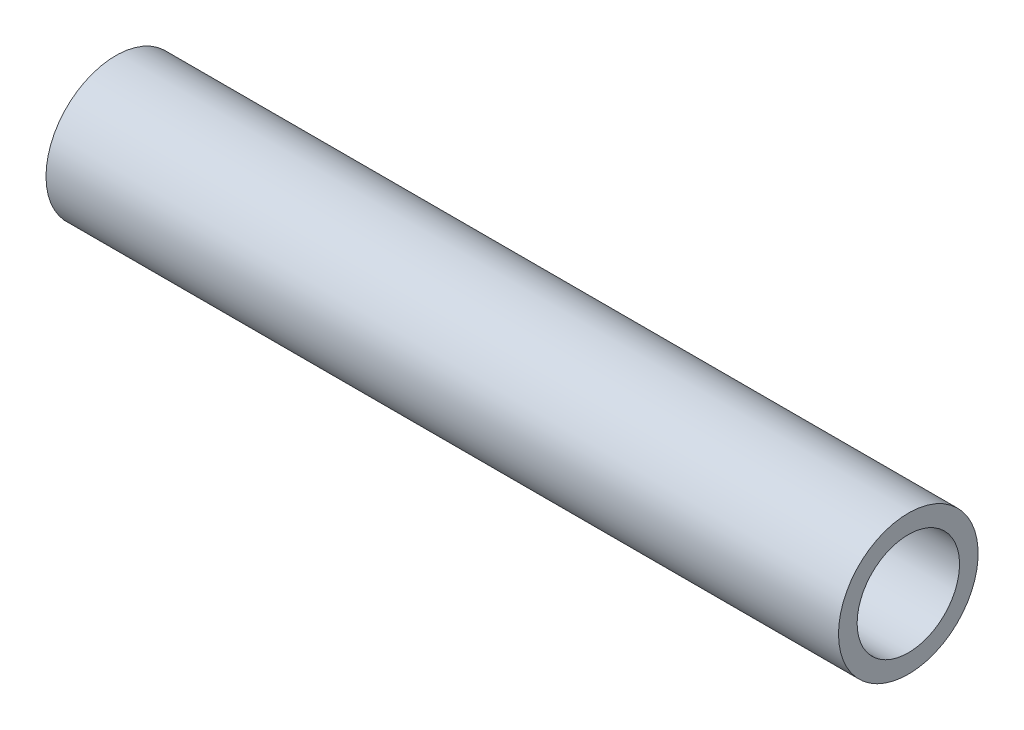
ISO-10303-21;
HEADER;
FILE_DESCRIPTION(('STEP AP214'),'2;1');
FILE_NAME('part.step','',(''),(''),'','','');
FILE_SCHEMA(('AUTOMOTIVE_DESIGN { 1 0 10303 214 1 1 1 1 }'));
ENDSEC;
DATA;
#1=APPLICATION_CONTEXT('core data for automotive mechanical design processes');
#2=APPLICATION_PROTOCOL_DEFINITION('international standard','automotive_design',2000,#1);
#3=PRODUCT_CONTEXT('',#1,'mechanical');
#4=PRODUCT('Part','Part','',(#3));
#5=PRODUCT_RELATED_PRODUCT_CATEGORY('part','',(#4));
#6=PRODUCT_DEFINITION_FORMATION('','',#4);
#7=PRODUCT_DEFINITION_CONTEXT('part definition',#1,'design');
#8=PRODUCT_DEFINITION('design','',#6,#7);
#9=PRODUCT_DEFINITION_SHAPE('','',#8);
#10=(LENGTH_UNIT() NAMED_UNIT(*) SI_UNIT(.MILLI.,.METRE.));
#11=(NAMED_UNIT(*) PLANE_ANGLE_UNIT() SI_UNIT($,.RADIAN.));
#12=(NAMED_UNIT(*) SI_UNIT($,.STERADIAN.) SOLID_ANGLE_UNIT());
#13=UNCERTAINTY_MEASURE_WITH_UNIT(LENGTH_MEASURE(1.E-05),#10,'distance_accuracy_value','');
#14=(GEOMETRIC_REPRESENTATION_CONTEXT(3) GLOBAL_UNCERTAINTY_ASSIGNED_CONTEXT((#13)) GLOBAL_UNIT_ASSIGNED_CONTEXT((#10,
#11,#12)) REPRESENTATION_CONTEXT('',''));
#15=CARTESIAN_POINT('',(0.,0.,0.));
#16=DIRECTION('',(0.,0.,1.));
#17=DIRECTION('',(1.,0.,0.));
#18=AXIS2_PLACEMENT_3D('',#15,#16,#17);
#19=CARTESIAN_POINT('',(0.,2.25,0.));
#20=DIRECTION('',(1.,0.,0.));
#21=DIRECTION('',(0.,0.,-1.));
#22=AXIS2_PLACEMENT_3D('',#19,#20,#21);
#23=PLANE('',#22);
#24=CARTESIAN_POINT('',(0.,0.,0.));
#25=DIRECTION('',(-1.,0.,0.));
#26=DIRECTION('',(0.,0.,1.));
#27=AXIS2_PLACEMENT_3D('',#24,#25,#26);
#28=CIRCLE('',#27,1.65);
#29=CARTESIAN_POINT('',(0.,0.,1.65));
#30=VERTEX_POINT('',#29);
#31=EDGE_CURVE('E10',#30,#30,#28,.T.);
#32=ORIENTED_EDGE('',*,*,#31,.F.);
#33=EDGE_LOOP('',(#32));
#34=FACE_BOUND('',#33,.T.);
#35=CARTESIAN_POINT('',(0.,0.,0.));
#36=DIRECTION('',(-1.,0.,0.));
#37=DIRECTION('',(0.,0.,1.));
#38=AXIS2_PLACEMENT_3D('',#35,#36,#37);
#39=CIRCLE('',#38,2.25);
#40=CARTESIAN_POINT('',(0.,0.,2.25));
#41=VERTEX_POINT('',#40);
#42=EDGE_CURVE('E45',#41,#41,#39,.T.);
#43=ORIENTED_EDGE('',*,*,#42,.T.);
#44=EDGE_LOOP('',(#43));
#45=FACE_BOUND('',#44,.T.);
#46=ADVANCED_FACE('F31',(#34,#45),#23,.F.);
#47=CARTESIAN_POINT('',(-110.,0.,0.));
#48=DIRECTION('',(-1.,0.,0.));
#49=DIRECTION('',(0.,0.,1.));
#50=AXIS2_PLACEMENT_3D('',#47,#48,#49);
#51=CYLINDRICAL_SURFACE('',#50,1.65);
#52=CARTESIAN_POINT('',(25.5409558004398,0.,0.));
#53=DIRECTION('',(-1.,0.,0.));
#54=DIRECTION('',(0.,0.,1.));
#55=AXIS2_PLACEMENT_3D('',#52,#53,#54);
#56=CIRCLE('',#55,1.65);
#57=CARTESIAN_POINT('',(25.5409558004398,0.,1.65));
#58=VERTEX_POINT('',#57);
#59=EDGE_CURVE('E37',#58,#58,#56,.T.);
#60=ORIENTED_EDGE('',*,*,#59,.F.);
#61=EDGE_LOOP('',(#60));
#62=FACE_BOUND('',#61,.T.);
#63=ORIENTED_EDGE('',*,*,#31,.T.);
#64=EDGE_LOOP('',(#63));
#65=FACE_BOUND('',#64,.T.);
#66=ADVANCED_FACE('F60',(#62,#65),#51,.F.);
#67=CARTESIAN_POINT('',(25.5409558004399,1.65,0.));
#68=DIRECTION('',(-1.,0.,0.));
#69=DIRECTION('',(0.,0.,1.));
#70=AXIS2_PLACEMENT_3D('',#67,#68,#69);
#71=PLANE('',#70);
#72=CARTESIAN_POINT('',(25.5409558004398,0.,0.));
#73=DIRECTION('',(-1.,0.,0.));
#74=DIRECTION('',(0.,0.,1.));
#75=AXIS2_PLACEMENT_3D('',#72,#73,#74);
#76=CIRCLE('',#75,2.25);
#77=CARTESIAN_POINT('',(25.5409558004398,0.,2.25));
#78=VERTEX_POINT('',#77);
#79=EDGE_CURVE('E41',#78,#78,#76,.T.);
#80=ORIENTED_EDGE('',*,*,#79,.F.);
#81=EDGE_LOOP('',(#80));
#82=FACE_BOUND('',#81,.T.);
#83=ORIENTED_EDGE('',*,*,#59,.T.);
#84=EDGE_LOOP('',(#83));
#85=FACE_BOUND('',#84,.T.);
#86=ADVANCED_FACE('F55',(#82,#85),#71,.F.);
#87=CARTESIAN_POINT('',(-110.,0.,0.));
#88=DIRECTION('',(-1.,0.,0.));
#89=DIRECTION('',(0.,0.,1.));
#90=AXIS2_PLACEMENT_3D('',#87,#88,#89);
#91=CYLINDRICAL_SURFACE('',#90,2.25);
#92=ORIENTED_EDGE('',*,*,#42,.F.);
#93=EDGE_LOOP('',(#92));
#94=FACE_BOUND('',#93,.T.);
#95=ORIENTED_EDGE('',*,*,#79,.T.);
#96=EDGE_LOOP('',(#95));
#97=FACE_BOUND('',#96,.T.);
#98=ADVANCED_FACE('F52',(#94,#97),#91,.T.);
#99=CLOSED_SHELL('',(#46,#66,#86,#98));
#100=MANIFOLD_SOLID_BREP('B2',#99);
#101=ADVANCED_BREP_SHAPE_REPRESENTATION('',(#18,#100),#14);
#102=SHAPE_DEFINITION_REPRESENTATION(#9,#101);
ENDSEC;
END-ISO-10303-21;
